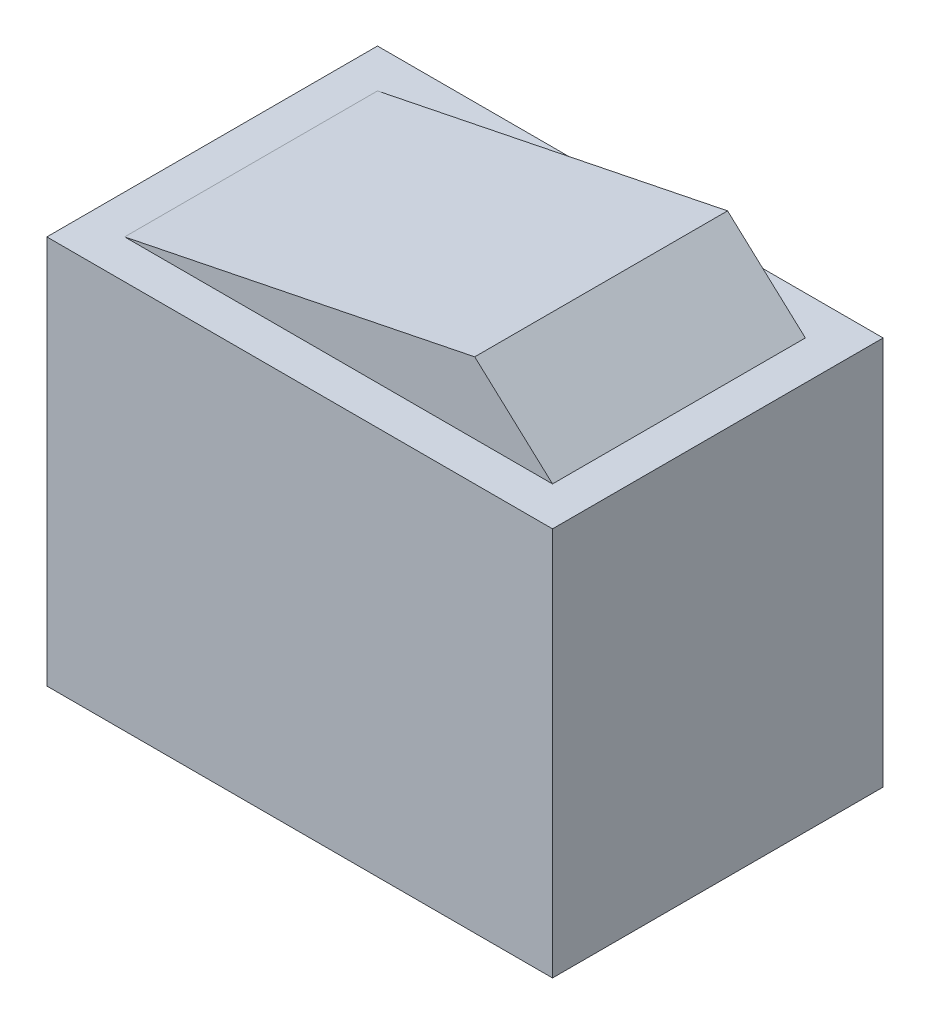
ISO-10303-21;
HEADER;
FILE_DESCRIPTION(('STEP AP214'),'2;1');
FILE_NAME('part.step','',(''),(''),'','','');
FILE_SCHEMA(('AUTOMOTIVE_DESIGN { 1 0 10303 214 1 1 1 1 }'));
ENDSEC;
DATA;
#1=APPLICATION_CONTEXT('core data for automotive mechanical design processes');
#2=APPLICATION_PROTOCOL_DEFINITION('international standard','automotive_design',2000,#1);
#3=PRODUCT_CONTEXT('',#1,'mechanical');
#4=PRODUCT('Part','Part','',(#3));
#5=PRODUCT_RELATED_PRODUCT_CATEGORY('part','',(#4));
#6=PRODUCT_DEFINITION_FORMATION('','',#4);
#7=PRODUCT_DEFINITION_CONTEXT('part definition',#1,'design');
#8=PRODUCT_DEFINITION('design','',#6,#7);
#9=PRODUCT_DEFINITION_SHAPE('','',#8);
#10=(LENGTH_UNIT() NAMED_UNIT(*) SI_UNIT(.MILLI.,.METRE.));
#11=(NAMED_UNIT(*) PLANE_ANGLE_UNIT() SI_UNIT($,.RADIAN.));
#12=(NAMED_UNIT(*) SI_UNIT($,.STERADIAN.) SOLID_ANGLE_UNIT());
#13=UNCERTAINTY_MEASURE_WITH_UNIT(LENGTH_MEASURE(1.E-05),#10,'distance_accuracy_value','');
#14=(GEOMETRIC_REPRESENTATION_CONTEXT(3) GLOBAL_UNCERTAINTY_ASSIGNED_CONTEXT((#13)) GLOBAL_UNIT_ASSIGNED_CONTEXT((#10,
#11,#12)) REPRESENTATION_CONTEXT('',''));
#15=CARTESIAN_POINT('',(0.,0.,0.));
#16=DIRECTION('',(0.,0.,1.));
#17=DIRECTION('',(1.,0.,0.));
#18=AXIS2_PLACEMENT_3D('',#15,#16,#17);
#19=CARTESIAN_POINT('',(6.5,10.,-4.25));
#20=DIRECTION('',(-1.,0.,0.));
#21=DIRECTION('',(0.,0.,1.));
#22=AXIS2_PLACEMENT_3D('',#19,#20,#21);
#23=PLANE('',#22);
#24=DIRECTION('',(0.,0.,-1.));
#25=VECTOR('',#24,1.);
#26=CARTESIAN_POINT('',(6.5,0.,-4.25));
#27=LINE('',#26,#25);
#28=CARTESIAN_POINT('',(6.5,0.,4.25));
#29=VERTEX_POINT('',#28);
#30=CARTESIAN_POINT('',(6.5,0.,-4.25));
#31=VERTEX_POINT('',#30);
#32=EDGE_CURVE('E150',#29,#31,#27,.T.);
#33=ORIENTED_EDGE('',*,*,#32,.T.);
#34=DIRECTION('',(0.,-1.,0.));
#35=VECTOR('',#34,1.);
#36=CARTESIAN_POINT('',(6.5,10.,-4.25));
#37=LINE('',#36,#35);
#38=CARTESIAN_POINT('',(6.5,10.,-4.25));
#39=VERTEX_POINT('',#38);
#40=EDGE_CURVE('E11',#39,#31,#37,.T.);
#41=ORIENTED_EDGE('',*,*,#40,.F.);
#42=DIRECTION('',(0.,0.,-1.));
#43=VECTOR('',#42,1.);
#44=CARTESIAN_POINT('',(6.5,10.,-4.25));
#45=LINE('',#44,#43);
#46=CARTESIAN_POINT('',(6.5,10.,4.25));
#47=VERTEX_POINT('',#46);
#48=EDGE_CURVE('E139',#47,#39,#45,.T.);
#49=ORIENTED_EDGE('',*,*,#48,.F.);
#50=DIRECTION('',(0.,-1.,0.));
#51=VECTOR('',#50,1.);
#52=CARTESIAN_POINT('',(6.5,10.,4.25));
#53=LINE('',#52,#51);
#54=EDGE_CURVE('E149',#47,#29,#53,.T.);
#55=ORIENTED_EDGE('',*,*,#54,.T.);
#56=EDGE_LOOP('',(#33,#41,#49,#55));
#57=FACE_BOUND('',#56,.T.);
#58=ADVANCED_FACE('F39',(#57),#23,.F.);
#59=CARTESIAN_POINT('',(-6.5,10.,-4.25));
#60=DIRECTION('',(0.,0.,1.));
#61=DIRECTION('',(1.,0.,0.));
#62=AXIS2_PLACEMENT_3D('',#59,#60,#61);
#63=PLANE('',#62);
#64=DIRECTION('',(-1.,0.,0.));
#65=VECTOR('',#64,1.);
#66=CARTESIAN_POINT('',(-6.5,0.,-4.25));
#67=LINE('',#66,#65);
#68=CARTESIAN_POINT('',(-6.5,0.,-4.25));
#69=VERTEX_POINT('',#68);
#70=EDGE_CURVE('E154',#31,#69,#67,.T.);
#71=ORIENTED_EDGE('',*,*,#70,.T.);
#72=DIRECTION('',(0.,-1.,0.));
#73=VECTOR('',#72,1.);
#74=CARTESIAN_POINT('',(-6.5,10.,-4.25));
#75=LINE('',#74,#73);
#76=CARTESIAN_POINT('',(-6.5,10.,-4.25));
#77=VERTEX_POINT('',#76);
#78=EDGE_CURVE('E47',#77,#69,#75,.T.);
#79=ORIENTED_EDGE('',*,*,#78,.F.);
#80=DIRECTION('',(-1.,0.,0.));
#81=VECTOR('',#80,1.);
#82=CARTESIAN_POINT('',(-6.5,10.,-4.25));
#83=LINE('',#82,#81);
#84=EDGE_CURVE('E91',#39,#77,#83,.T.);
#85=ORIENTED_EDGE('',*,*,#84,.F.);
#86=ORIENTED_EDGE('',*,*,#40,.T.);
#87=EDGE_LOOP('',(#71,#79,#85,#86));
#88=FACE_BOUND('',#87,.T.);
#89=ADVANCED_FACE('F187',(#88),#63,.F.);
#90=CARTESIAN_POINT('',(-6.5,10.,-4.25));
#91=DIRECTION('',(1.,0.,0.));
#92=DIRECTION('',(0.,0.,-1.));
#93=AXIS2_PLACEMENT_3D('',#90,#91,#92);
#94=PLANE('',#93);
#95=DIRECTION('',(0.,0.,1.));
#96=VECTOR('',#95,1.);
#97=CARTESIAN_POINT('',(-6.5,0.,-4.25));
#98=LINE('',#97,#96);
#99=CARTESIAN_POINT('',(-6.5,0.,4.25));
#100=VERTEX_POINT('',#99);
#101=EDGE_CURVE('E157',#69,#100,#98,.T.);
#102=ORIENTED_EDGE('',*,*,#101,.T.);
#103=DIRECTION('',(0.,-1.,0.));
#104=VECTOR('',#103,1.);
#105=CARTESIAN_POINT('',(-6.5,10.,4.25));
#106=LINE('',#105,#104);
#107=CARTESIAN_POINT('',(-6.5,10.,4.25));
#108=VERTEX_POINT('',#107);
#109=EDGE_CURVE('E164',#108,#100,#106,.T.);
#110=ORIENTED_EDGE('',*,*,#109,.F.);
#111=DIRECTION('',(0.,0.,1.));
#112=VECTOR('',#111,1.);
#113=CARTESIAN_POINT('',(-6.5,10.,-4.25));
#114=LINE('',#113,#112);
#115=EDGE_CURVE('E144',#77,#108,#114,.T.);
#116=ORIENTED_EDGE('',*,*,#115,.F.);
#117=ORIENTED_EDGE('',*,*,#78,.T.);
#118=EDGE_LOOP('',(#102,#110,#116,#117));
#119=FACE_BOUND('',#118,.T.);
#120=ADVANCED_FACE('F171',(#119),#94,.F.);
#121=CARTESIAN_POINT('',(-6.5,10.,4.25));
#122=DIRECTION('',(0.,0.,-1.));
#123=DIRECTION('',(-1.,0.,0.));
#124=AXIS2_PLACEMENT_3D('',#121,#122,#123);
#125=PLANE('',#124);
#126=DIRECTION('',(1.,0.,0.));
#127=VECTOR('',#126,1.);
#128=CARTESIAN_POINT('',(-6.5,0.,4.25));
#129=LINE('',#128,#127);
#130=EDGE_CURVE('E84',#100,#29,#129,.T.);
#131=ORIENTED_EDGE('',*,*,#130,.T.);
#132=ORIENTED_EDGE('',*,*,#54,.F.);
#133=DIRECTION('',(1.,0.,0.));
#134=VECTOR('',#133,1.);
#135=CARTESIAN_POINT('',(-6.5,10.,4.25));
#136=LINE('',#135,#134);
#137=EDGE_CURVE('E63',#108,#47,#136,.T.);
#138=ORIENTED_EDGE('',*,*,#137,.F.);
#139=ORIENTED_EDGE('',*,*,#109,.T.);
#140=EDGE_LOOP('',(#131,#132,#138,#139));
#141=FACE_BOUND('',#140,.T.);
#142=ADVANCED_FACE('F179',(#141),#125,.F.);
#143=CARTESIAN_POINT('',(0.,10.,0.));
#144=DIRECTION('',(0.,1.,0.));
#145=DIRECTION('',(0.,0.,1.));
#146=AXIS2_PLACEMENT_3D('',#143,#144,#145);
#147=PLANE('',#146);
#148=DIRECTION('',(1.,0.,0.));
#149=VECTOR('',#148,1.);
#150=CARTESIAN_POINT('',(-5.5,10.,3.25));
#151=LINE('',#150,#149);
#152=CARTESIAN_POINT('',(-5.5,10.,3.25));
#153=VERTEX_POINT('',#152);
#154=CARTESIAN_POINT('',(5.5,10.,3.25));
#155=VERTEX_POINT('',#154);
#156=EDGE_CURVE('E129',#153,#155,#151,.T.);
#157=ORIENTED_EDGE('',*,*,#156,.F.);
#158=DIRECTION('',(0.,0.,1.));
#159=VECTOR('',#158,1.);
#160=CARTESIAN_POINT('',(-5.5,10.,-3.25));
#161=LINE('',#160,#159);
#162=CARTESIAN_POINT('',(-5.5,10.,-3.25));
#163=VERTEX_POINT('',#162);
#164=EDGE_CURVE('E122',#163,#153,#161,.T.);
#165=ORIENTED_EDGE('',*,*,#164,.F.);
#166=DIRECTION('',(1.,0.,0.));
#167=VECTOR('',#166,1.);
#168=CARTESIAN_POINT('',(-5.5,10.,-3.25));
#169=LINE('',#168,#167);
#170=CARTESIAN_POINT('',(5.5,10.,-3.25));
#171=VERTEX_POINT('',#170);
#172=EDGE_CURVE('E108',#163,#171,#169,.T.);
#173=ORIENTED_EDGE('',*,*,#172,.T.);
#174=DIRECTION('',(0.,0.,1.));
#175=VECTOR('',#174,1.);
#176=CARTESIAN_POINT('',(5.5,10.,-3.25));
#177=LINE('',#176,#175);
#178=EDGE_CURVE('E131',#171,#155,#177,.T.);
#179=ORIENTED_EDGE('',*,*,#178,.T.);
#180=EDGE_LOOP('',(#157,#165,#173,#179));
#181=FACE_BOUND('',#180,.T.);
#182=ORIENTED_EDGE('',*,*,#48,.T.);
#183=ORIENTED_EDGE('',*,*,#84,.T.);
#184=ORIENTED_EDGE('',*,*,#115,.T.);
#185=ORIENTED_EDGE('',*,*,#137,.T.);
#186=EDGE_LOOP('',(#182,#183,#184,#185));
#187=FACE_BOUND('',#186,.T.);
#188=ADVANCED_FACE('F128',(#181,#187),#147,.T.);
#189=CARTESIAN_POINT('',(0.,0.,0.));
#190=DIRECTION('',(0.,1.,0.));
#191=DIRECTION('',(0.,0.,1.));
#192=AXIS2_PLACEMENT_3D('',#189,#190,#191);
#193=PLANE('',#192);
#194=ORIENTED_EDGE('',*,*,#32,.F.);
#195=ORIENTED_EDGE('',*,*,#130,.F.);
#196=ORIENTED_EDGE('',*,*,#101,.F.);
#197=ORIENTED_EDGE('',*,*,#70,.F.);
#198=EDGE_LOOP('',(#194,#195,#196,#197));
#199=FACE_BOUND('',#198,.T.);
#200=ADVANCED_FACE('F175',(#199),#193,.F.);
#201=CARTESIAN_POINT('',(3.5,11.8297406835196,-3.25));
#202=DIRECTION('',(-0.19922887200993,0.979952986911949,0.));
#203=DIRECTION('',(-0.979952986911949,-0.19922887200993,0.));
#204=AXIS2_PLACEMENT_3D('',#201,#202,#203);
#205=PLANE('',#204);
#206=DIRECTION('',(-0.979952986911949,-0.19922887200993,0.));
#207=VECTOR('',#206,1.);
#208=CARTESIAN_POINT('',(3.5,11.8297406835196,3.25));
#209=LINE('',#208,#207);
#210=CARTESIAN_POINT('',(3.5,11.8297406835196,3.25));
#211=VERTEX_POINT('',#210);
#212=EDGE_CURVE('E256',#211,#153,#209,.T.);
#213=ORIENTED_EDGE('',*,*,#212,.F.);
#214=DIRECTION('',(0.,0.,1.));
#215=VECTOR('',#214,1.);
#216=CARTESIAN_POINT('',(3.5,11.8297406835196,-3.25));
#217=LINE('',#216,#215);
#218=CARTESIAN_POINT('',(3.5,11.8297406835196,-3.25));
#219=VERTEX_POINT('',#218);
#220=EDGE_CURVE('E124',#219,#211,#217,.T.);
#221=ORIENTED_EDGE('',*,*,#220,.F.);
#222=DIRECTION('',(-0.979952986911949,-0.19922887200993,0.));
#223=VECTOR('',#222,1.);
#224=CARTESIAN_POINT('',(3.5,11.8297406835196,-3.25));
#225=LINE('',#224,#223);
#226=EDGE_CURVE('E111',#219,#163,#225,.T.);
#227=ORIENTED_EDGE('',*,*,#226,.T.);
#228=ORIENTED_EDGE('',*,*,#164,.T.);
#229=EDGE_LOOP('',(#213,#221,#227,#228));
#230=FACE_BOUND('',#229,.T.);
#231=ADVANCED_FACE('F121',(#230),#205,.T.);
#232=CARTESIAN_POINT('',(5.5,10.,-3.25));
#233=DIRECTION('',(0.675004113879061,0.737813964523811,0.));
#234=DIRECTION('',(-0.737813964523811,0.675004113879061,0.));
#235=AXIS2_PLACEMENT_3D('',#232,#233,#234);
#236=PLANE('',#235);
#237=DIRECTION('',(-0.737813964523811,0.675004113879061,0.));
#238=VECTOR('',#237,1.);
#239=CARTESIAN_POINT('',(5.5,10.,3.25));
#240=LINE('',#239,#238);
#241=EDGE_CURVE('E54',#155,#211,#240,.T.);
#242=ORIENTED_EDGE('',*,*,#241,.F.);
#243=ORIENTED_EDGE('',*,*,#178,.F.);
#244=DIRECTION('',(-0.737813964523811,0.675004113879061,0.));
#245=VECTOR('',#244,1.);
#246=CARTESIAN_POINT('',(5.5,10.,-3.25));
#247=LINE('',#246,#245);
#248=EDGE_CURVE('E113',#171,#219,#247,.T.);
#249=ORIENTED_EDGE('',*,*,#248,.T.);
#250=ORIENTED_EDGE('',*,*,#220,.T.);
#251=EDGE_LOOP('',(#242,#243,#249,#250));
#252=FACE_BOUND('',#251,.T.);
#253=ADVANCED_FACE('F226',(#252),#236,.T.);
#254=CARTESIAN_POINT('',(0.,0.,-3.25));
#255=DIRECTION('',(0.,0.,-1.));
#256=DIRECTION('',(-1.,0.,0.));
#257=AXIS2_PLACEMENT_3D('',#254,#255,#256);
#258=PLANE('',#257);
#259=ORIENTED_EDGE('',*,*,#226,.F.);
#260=ORIENTED_EDGE('',*,*,#248,.F.);
#261=ORIENTED_EDGE('',*,*,#172,.F.);
#262=EDGE_LOOP('',(#259,#260,#261));
#263=FACE_BOUND('',#262,.T.);
#264=ADVANCED_FACE('F110',(#263),#258,.T.);
#265=CARTESIAN_POINT('',(0.,0.,3.25));
#266=DIRECTION('',(0.,0.,-1.));
#267=DIRECTION('',(-1.,0.,0.));
#268=AXIS2_PLACEMENT_3D('',#265,#266,#267);
#269=PLANE('',#268);
#270=ORIENTED_EDGE('',*,*,#212,.T.);
#271=ORIENTED_EDGE('',*,*,#156,.T.);
#272=ORIENTED_EDGE('',*,*,#241,.T.);
#273=EDGE_LOOP('',(#270,#271,#272));
#274=FACE_BOUND('',#273,.T.);
#275=ADVANCED_FACE('F243',(#274),#269,.F.);
#276=CLOSED_SHELL('',(#58,#89,#120,#142,#188,#200,#231,#253,#264,#275));
#277=MANIFOLD_SOLID_BREP('B2',#276);
#278=ADVANCED_BREP_SHAPE_REPRESENTATION('',(#18,#277),#14);
#279=SHAPE_DEFINITION_REPRESENTATION(#9,#278);
ENDSEC;
END-ISO-10303-21;
